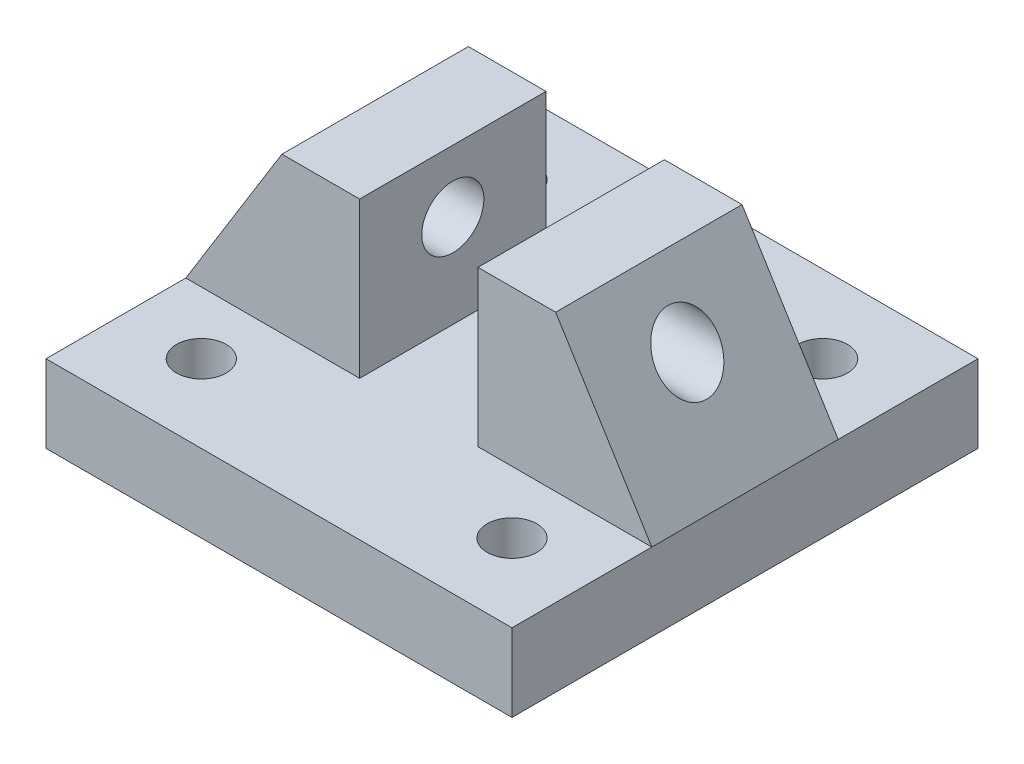
ISO-10303-21;
HEADER;
FILE_DESCRIPTION(('STEP AP214'),'2;1');
FILE_NAME('part.step','',(''),(''),'','','');
FILE_SCHEMA(('AUTOMOTIVE_DESIGN { 1 0 10303 214 1 1 1 1 }'));
ENDSEC;
DATA;
#1=APPLICATION_CONTEXT('core data for automotive mechanical design processes');
#2=APPLICATION_PROTOCOL_DEFINITION('international standard','automotive_design',2000,#1);
#3=PRODUCT_CONTEXT('',#1,'mechanical');
#4=PRODUCT('Part','Part','',(#3));
#5=PRODUCT_RELATED_PRODUCT_CATEGORY('part','',(#4));
#6=PRODUCT_DEFINITION_FORMATION('','',#4);
#7=PRODUCT_DEFINITION_CONTEXT('part definition',#1,'design');
#8=PRODUCT_DEFINITION('design','',#6,#7);
#9=PRODUCT_DEFINITION_SHAPE('','',#8);
#10=(LENGTH_UNIT() NAMED_UNIT(*) SI_UNIT(.MILLI.,.METRE.));
#11=(NAMED_UNIT(*) PLANE_ANGLE_UNIT() SI_UNIT($,.RADIAN.));
#12=(NAMED_UNIT(*) SI_UNIT($,.STERADIAN.) SOLID_ANGLE_UNIT());
#13=UNCERTAINTY_MEASURE_WITH_UNIT(LENGTH_MEASURE(1.E-05),#10,'distance_accuracy_value','');
#14=(GEOMETRIC_REPRESENTATION_CONTEXT(3) GLOBAL_UNCERTAINTY_ASSIGNED_CONTEXT((#13)) GLOBAL_UNIT_ASSIGNED_CONTEXT((#10,
#11,#12)) REPRESENTATION_CONTEXT('',''));
#15=CARTESIAN_POINT('',(0.,0.,0.));
#16=DIRECTION('',(0.,0.,1.));
#17=DIRECTION('',(1.,0.,0.));
#18=AXIS2_PLACEMENT_3D('',#15,#16,#17);
#19=CARTESIAN_POINT('',(15.,5.,-15.));
#20=DIRECTION('',(-1.,0.,0.));
#21=DIRECTION('',(0.,0.,1.));
#22=AXIS2_PLACEMENT_3D('',#19,#20,#21);
#23=PLANE('',#22);
#24=DIRECTION('',(0.,0.,-1.));
#25=VECTOR('',#24,1.);
#26=CARTESIAN_POINT('',(15.,5.,-15.));
#27=LINE('',#26,#25);
#28=CARTESIAN_POINT('',(15.,5.,-6.));
#29=VERTEX_POINT('',#28);
#30=CARTESIAN_POINT('',(15.,5.,-15.));
#31=VERTEX_POINT('',#30);
#32=EDGE_CURVE('E151',#29,#31,#27,.T.);
#33=ORIENTED_EDGE('',*,*,#32,.F.);
#34=DIRECTION('',(0.,0.,1.));
#35=VECTOR('',#34,1.);
#36=CARTESIAN_POINT('',(15.,5.,-6.));
#37=LINE('',#36,#35);
#38=CARTESIAN_POINT('',(15.,5.,6.));
#39=VERTEX_POINT('',#38);
#40=EDGE_CURVE('E139',#29,#39,#37,.T.);
#41=ORIENTED_EDGE('',*,*,#40,.T.);
#42=CARTESIAN_POINT('',(15.,5.,15.));
#43=VERTEX_POINT('',#42);
#44=EDGE_CURVE('E149',#43,#39,#27,.T.);
#45=ORIENTED_EDGE('',*,*,#44,.F.);
#46=DIRECTION('',(0.,-1.,0.));
#47=VECTOR('',#46,1.);
#48=CARTESIAN_POINT('',(15.,5.,15.));
#49=LINE('',#48,#47);
#50=CARTESIAN_POINT('',(15.,0.,15.));
#51=VERTEX_POINT('',#50);
#52=EDGE_CURVE('E170',#43,#51,#49,.T.);
#53=ORIENTED_EDGE('',*,*,#52,.T.);
#54=DIRECTION('',(0.,0.,-1.));
#55=VECTOR('',#54,1.);
#56=CARTESIAN_POINT('',(15.,0.,-15.));
#57=LINE('',#56,#55);
#58=CARTESIAN_POINT('',(15.,0.,-15.));
#59=VERTEX_POINT('',#58);
#60=EDGE_CURVE('E171',#51,#59,#57,.T.);
#61=ORIENTED_EDGE('',*,*,#60,.T.);
#62=DIRECTION('',(0.,-1.,0.));
#63=VECTOR('',#62,1.);
#64=CARTESIAN_POINT('',(15.,5.,-15.));
#65=LINE('',#64,#63);
#66=EDGE_CURVE('E11',#31,#59,#65,.T.);
#67=ORIENTED_EDGE('',*,*,#66,.F.);
#68=EDGE_LOOP('',(#33,#41,#45,#53,#61,#67));
#69=FACE_BOUND('',#68,.T.);
#70=ADVANCED_FACE('F34',(#69),#23,.F.);
#71=CARTESIAN_POINT('',(-15.,5.,-15.));
#72=DIRECTION('',(0.,0.,1.));
#73=DIRECTION('',(1.,0.,0.));
#74=AXIS2_PLACEMENT_3D('',#71,#72,#73);
#75=PLANE('',#74);
#76=DIRECTION('',(-1.,0.,0.));
#77=VECTOR('',#76,1.);
#78=CARTESIAN_POINT('',(-15.,0.,-15.));
#79=LINE('',#78,#77);
#80=CARTESIAN_POINT('',(-15.,0.,-15.));
#81=VERTEX_POINT('',#80);
#82=EDGE_CURVE('E173',#59,#81,#79,.T.);
#83=ORIENTED_EDGE('',*,*,#82,.T.);
#84=DIRECTION('',(0.,-1.,0.));
#85=VECTOR('',#84,1.);
#86=CARTESIAN_POINT('',(-15.,5.,-15.));
#87=LINE('',#86,#85);
#88=CARTESIAN_POINT('',(-15.,5.,-15.));
#89=VERTEX_POINT('',#88);
#90=EDGE_CURVE('E42',#89,#81,#87,.T.);
#91=ORIENTED_EDGE('',*,*,#90,.F.);
#92=DIRECTION('',(-1.,0.,0.));
#93=VECTOR('',#92,1.);
#94=CARTESIAN_POINT('',(-15.,5.,-15.));
#95=LINE('',#94,#93);
#96=EDGE_CURVE('E159',#31,#89,#95,.T.);
#97=ORIENTED_EDGE('',*,*,#96,.F.);
#98=ORIENTED_EDGE('',*,*,#66,.T.);
#99=EDGE_LOOP('',(#83,#91,#97,#98));
#100=FACE_BOUND('',#99,.T.);
#101=ADVANCED_FACE('F200',(#100),#75,.F.);
#102=CARTESIAN_POINT('',(-15.,5.,-15.));
#103=DIRECTION('',(1.,0.,0.));
#104=DIRECTION('',(0.,0.,-1.));
#105=AXIS2_PLACEMENT_3D('',#102,#103,#104);
#106=PLANE('',#105);
#107=DIRECTION('',(0.,0.,1.));
#108=VECTOR('',#107,1.);
#109=CARTESIAN_POINT('',(-15.,0.,-15.));
#110=LINE('',#109,#108);
#111=CARTESIAN_POINT('',(-15.,0.,15.));
#112=VERTEX_POINT('',#111);
#113=EDGE_CURVE('E176',#81,#112,#110,.T.);
#114=ORIENTED_EDGE('',*,*,#113,.T.);
#115=DIRECTION('',(0.,-1.,0.));
#116=VECTOR('',#115,1.);
#117=CARTESIAN_POINT('',(-15.,5.,15.));
#118=LINE('',#117,#116);
#119=CARTESIAN_POINT('',(-15.,5.,15.));
#120=VERTEX_POINT('',#119);
#121=EDGE_CURVE('E180',#120,#112,#118,.T.);
#122=ORIENTED_EDGE('',*,*,#121,.F.);
#123=DIRECTION('',(0.,0.,1.));
#124=VECTOR('',#123,1.);
#125=CARTESIAN_POINT('',(-15.,5.,-15.));
#126=LINE('',#125,#124);
#127=CARTESIAN_POINT('',(-15.,5.,6.));
#128=VERTEX_POINT('',#127);
#129=EDGE_CURVE('E161',#128,#120,#126,.T.);
#130=ORIENTED_EDGE('',*,*,#129,.F.);
#131=DIRECTION('',(0.,0.,1.));
#132=VECTOR('',#131,1.);
#133=CARTESIAN_POINT('',(-15.,5.,-6.));
#134=LINE('',#133,#132);
#135=CARTESIAN_POINT('',(-15.,5.,-6.));
#136=VERTEX_POINT('',#135);
#137=EDGE_CURVE('E217',#136,#128,#134,.T.);
#138=ORIENTED_EDGE('',*,*,#137,.F.);
#139=EDGE_CURVE('E166',#89,#136,#126,.T.);
#140=ORIENTED_EDGE('',*,*,#139,.F.);
#141=ORIENTED_EDGE('',*,*,#90,.T.);
#142=EDGE_LOOP('',(#114,#122,#130,#138,#140,#141));
#143=FACE_BOUND('',#142,.T.);
#144=ADVANCED_FACE('F188',(#143),#106,.F.);
#145=CARTESIAN_POINT('',(-15.,5.,15.));
#146=DIRECTION('',(0.,0.,-1.));
#147=DIRECTION('',(-1.,0.,0.));
#148=AXIS2_PLACEMENT_3D('',#145,#146,#147);
#149=PLANE('',#148);
#150=DIRECTION('',(1.,0.,0.));
#151=VECTOR('',#150,1.);
#152=CARTESIAN_POINT('',(-15.,0.,15.));
#153=LINE('',#152,#151);
#154=EDGE_CURVE('E163',#112,#51,#153,.T.);
#155=ORIENTED_EDGE('',*,*,#154,.T.);
#156=ORIENTED_EDGE('',*,*,#52,.F.);
#157=DIRECTION('',(1.,0.,0.));
#158=VECTOR('',#157,1.);
#159=CARTESIAN_POINT('',(-15.,5.,15.));
#160=LINE('',#159,#158);
#161=EDGE_CURVE('E157',#120,#43,#160,.T.);
#162=ORIENTED_EDGE('',*,*,#161,.F.);
#163=ORIENTED_EDGE('',*,*,#121,.T.);
#164=EDGE_LOOP('',(#155,#156,#162,#163));
#165=FACE_BOUND('',#164,.T.);
#166=ADVANCED_FACE('F199',(#165),#149,.F.);
#167=CARTESIAN_POINT('',(0.,5.,0.));
#168=DIRECTION('',(0.,1.,0.));
#169=DIRECTION('',(0.,0.,1.));
#170=AXIS2_PLACEMENT_3D('',#167,#168,#169);
#171=PLANE('',#170);
#172=CARTESIAN_POINT('',(-10.,5.,-10.));
#173=DIRECTION('',(0.,1.,0.));
#174=DIRECTION('',(0.,0.,1.));
#175=AXIS2_PLACEMENT_3D('',#172,#173,#174);
#176=CIRCLE('',#175,1.6);
#177=CARTESIAN_POINT('',(-10.,5.,-8.4));
#178=VERTEX_POINT('',#177);
#179=EDGE_CURVE('E475',#178,#178,#176,.T.);
#180=ORIENTED_EDGE('',*,*,#179,.F.);
#181=EDGE_LOOP('',(#180));
#182=FACE_BOUND('',#181,.T.);
#183=CARTESIAN_POINT('',(10.,5.,-10.));
#184=DIRECTION('',(0.,1.,0.));
#185=DIRECTION('',(0.,0.,1.));
#186=AXIS2_PLACEMENT_3D('',#183,#184,#185);
#187=CIRCLE('',#186,1.6);
#188=CARTESIAN_POINT('',(10.,5.,-8.4));
#189=VERTEX_POINT('',#188);
#190=EDGE_CURVE('E481',#189,#189,#187,.T.);
#191=ORIENTED_EDGE('',*,*,#190,.F.);
#192=EDGE_LOOP('',(#191));
#193=FACE_BOUND('',#192,.T.);
#194=CARTESIAN_POINT('',(10.,5.,10.));
#195=DIRECTION('',(0.,1.,0.));
#196=DIRECTION('',(0.,0.,1.));
#197=AXIS2_PLACEMENT_3D('',#194,#195,#196);
#198=CIRCLE('',#197,1.6);
#199=CARTESIAN_POINT('',(10.,5.,11.6));
#200=VERTEX_POINT('',#199);
#201=EDGE_CURVE('E487',#200,#200,#198,.T.);
#202=ORIENTED_EDGE('',*,*,#201,.F.);
#203=EDGE_LOOP('',(#202));
#204=FACE_BOUND('',#203,.T.);
#205=CARTESIAN_POINT('',(-10.,5.,10.));
#206=DIRECTION('',(0.,1.,0.));
#207=DIRECTION('',(0.,0.,1.));
#208=AXIS2_PLACEMENT_3D('',#205,#206,#207);
#209=CIRCLE('',#208,1.6);
#210=CARTESIAN_POINT('',(-10.,5.,11.6));
#211=VERTEX_POINT('',#210);
#212=EDGE_CURVE('E493',#211,#211,#209,.T.);
#213=ORIENTED_EDGE('',*,*,#212,.F.);
#214=EDGE_LOOP('',(#213));
#215=FACE_BOUND('',#214,.T.);
#216=DIRECTION('',(-1.,0.,0.));
#217=VECTOR('',#216,1.);
#218=CARTESIAN_POINT('',(0.,5.,-6.));
#219=LINE('',#218,#217);
#220=CARTESIAN_POINT('',(3.81,5.,-6.));
#221=VERTEX_POINT('',#220);
#222=EDGE_CURVE('E174',#29,#221,#219,.T.);
#223=ORIENTED_EDGE('',*,*,#222,.F.);
#224=ORIENTED_EDGE('',*,*,#32,.T.);
#225=ORIENTED_EDGE('',*,*,#96,.T.);
#226=ORIENTED_EDGE('',*,*,#139,.T.);
#227=CARTESIAN_POINT('',(-3.81,5.,-6.));
#228=VERTEX_POINT('',#227);
#229=EDGE_CURVE('E132',#228,#136,#219,.T.);
#230=ORIENTED_EDGE('',*,*,#229,.F.);
#231=DIRECTION('',(0.,0.,1.));
#232=VECTOR('',#231,1.);
#233=CARTESIAN_POINT('',(-3.81,5.,-6.));
#234=LINE('',#233,#232);
#235=CARTESIAN_POINT('',(-3.81,5.,6.));
#236=VERTEX_POINT('',#235);
#237=EDGE_CURVE('E230',#228,#236,#234,.T.);
#238=ORIENTED_EDGE('',*,*,#237,.T.);
#239=DIRECTION('',(-1.,0.,0.));
#240=VECTOR('',#239,1.);
#241=CARTESIAN_POINT('',(0.,5.,6.));
#242=LINE('',#241,#240);
#243=EDGE_CURVE('E133',#236,#128,#242,.T.);
#244=ORIENTED_EDGE('',*,*,#243,.T.);
#245=ORIENTED_EDGE('',*,*,#129,.T.);
#246=ORIENTED_EDGE('',*,*,#161,.T.);
#247=ORIENTED_EDGE('',*,*,#44,.T.);
#248=CARTESIAN_POINT('',(3.81,5.,6.));
#249=VERTEX_POINT('',#248);
#250=EDGE_CURVE('E124',#39,#249,#242,.T.);
#251=ORIENTED_EDGE('',*,*,#250,.T.);
#252=DIRECTION('',(0.,0.,1.));
#253=VECTOR('',#252,1.);
#254=CARTESIAN_POINT('',(3.81,5.,-6.));
#255=LINE('',#254,#253);
#256=EDGE_CURVE('E202',#221,#249,#255,.T.);
#257=ORIENTED_EDGE('',*,*,#256,.F.);
#258=EDGE_LOOP('',(#223,#224,#225,#226,#230,#238,#244,#245,#246,#247,#251,#257));
#259=FACE_BOUND('',#258,.T.);
#260=ADVANCED_FACE('F155',(#182,#193,#204,#215,#259),#171,.T.);
#261=CARTESIAN_POINT('',(0.,0.,0.));
#262=DIRECTION('',(0.,1.,0.));
#263=DIRECTION('',(0.,0.,1.));
#264=AXIS2_PLACEMENT_3D('',#261,#262,#263);
#265=PLANE('',#264);
#266=CARTESIAN_POINT('',(-10.,0.,-10.));
#267=DIRECTION('',(0.,1.,0.));
#268=DIRECTION('',(0.,0.,1.));
#269=AXIS2_PLACEMENT_3D('',#266,#267,#268);
#270=CIRCLE('',#269,1.6);
#271=CARTESIAN_POINT('',(-10.,0.,-8.4));
#272=VERTEX_POINT('',#271);
#273=EDGE_CURVE('E478',#272,#272,#270,.T.);
#274=ORIENTED_EDGE('',*,*,#273,.T.);
#275=EDGE_LOOP('',(#274));
#276=FACE_BOUND('',#275,.T.);
#277=CARTESIAN_POINT('',(10.,0.,-10.));
#278=DIRECTION('',(0.,1.,0.));
#279=DIRECTION('',(0.,0.,1.));
#280=AXIS2_PLACEMENT_3D('',#277,#278,#279);
#281=CIRCLE('',#280,1.6);
#282=CARTESIAN_POINT('',(10.,0.,-8.4));
#283=VERTEX_POINT('',#282);
#284=EDGE_CURVE('E484',#283,#283,#281,.T.);
#285=ORIENTED_EDGE('',*,*,#284,.T.);
#286=EDGE_LOOP('',(#285));
#287=FACE_BOUND('',#286,.T.);
#288=CARTESIAN_POINT('',(10.,0.,10.));
#289=DIRECTION('',(0.,1.,0.));
#290=DIRECTION('',(0.,0.,1.));
#291=AXIS2_PLACEMENT_3D('',#288,#289,#290);
#292=CIRCLE('',#291,1.6);
#293=CARTESIAN_POINT('',(10.,0.,11.6));
#294=VERTEX_POINT('',#293);
#295=EDGE_CURVE('E490',#294,#294,#292,.T.);
#296=ORIENTED_EDGE('',*,*,#295,.T.);
#297=EDGE_LOOP('',(#296));
#298=FACE_BOUND('',#297,.T.);
#299=CARTESIAN_POINT('',(-10.,0.,10.));
#300=DIRECTION('',(0.,1.,0.));
#301=DIRECTION('',(0.,0.,1.));
#302=AXIS2_PLACEMENT_3D('',#299,#300,#301);
#303=CIRCLE('',#302,1.6);
#304=CARTESIAN_POINT('',(-10.,0.,11.6));
#305=VERTEX_POINT('',#304);
#306=EDGE_CURVE('E143',#305,#305,#303,.T.);
#307=ORIENTED_EDGE('',*,*,#306,.T.);
#308=EDGE_LOOP('',(#307));
#309=FACE_BOUND('',#308,.T.);
#310=ORIENTED_EDGE('',*,*,#82,.F.);
#311=ORIENTED_EDGE('',*,*,#60,.F.);
#312=ORIENTED_EDGE('',*,*,#154,.F.);
#313=ORIENTED_EDGE('',*,*,#113,.F.);
#314=EDGE_LOOP('',(#310,#311,#312,#313));
#315=FACE_BOUND('',#314,.T.);
#316=ADVANCED_FACE('F196',(#276,#287,#298,#309,#315),#265,.F.);
#317=CARTESIAN_POINT('',(-8.81,15.,-6.));
#318=DIRECTION('',(0.,1.,0.));
#319=DIRECTION('',(0.,0.,1.));
#320=AXIS2_PLACEMENT_3D('',#317,#318,#319);
#321=PLANE('',#320);
#322=DIRECTION('',(0.,0.,1.));
#323=VECTOR('',#322,1.);
#324=CARTESIAN_POINT('',(-8.81,15.,-6.));
#325=LINE('',#324,#323);
#326=CARTESIAN_POINT('',(-8.81,15.,-6.));
#327=VERTEX_POINT('',#326);
#328=CARTESIAN_POINT('',(-8.81,15.,6.));
#329=VERTEX_POINT('',#328);
#330=EDGE_CURVE('E219',#327,#329,#325,.T.);
#331=ORIENTED_EDGE('',*,*,#330,.T.);
#332=DIRECTION('',(-1.,0.,0.));
#333=VECTOR('',#332,1.);
#334=CARTESIAN_POINT('',(-8.81,15.,6.));
#335=LINE('',#334,#333);
#336=CARTESIAN_POINT('',(-3.81,15.,6.));
#337=VERTEX_POINT('',#336);
#338=EDGE_CURVE('E246',#337,#329,#335,.T.);
#339=ORIENTED_EDGE('',*,*,#338,.F.);
#340=DIRECTION('',(0.,0.,1.));
#341=VECTOR('',#340,1.);
#342=CARTESIAN_POINT('',(-3.81,15.,-6.));
#343=LINE('',#342,#341);
#344=CARTESIAN_POINT('',(-3.81,15.,-6.));
#345=VERTEX_POINT('',#344);
#346=EDGE_CURVE('E225',#345,#337,#343,.T.);
#347=ORIENTED_EDGE('',*,*,#346,.F.);
#348=DIRECTION('',(-1.,0.,0.));
#349=VECTOR('',#348,1.);
#350=CARTESIAN_POINT('',(-8.81,15.,-6.));
#351=LINE('',#350,#349);
#352=EDGE_CURVE('E221',#345,#327,#351,.T.);
#353=ORIENTED_EDGE('',*,*,#352,.T.);
#354=EDGE_LOOP('',(#331,#339,#347,#353));
#355=FACE_BOUND('',#354,.T.);
#356=ADVANCED_FACE('F257',(#355),#321,.T.);
#357=CARTESIAN_POINT('',(0.,0.,-6.));
#358=DIRECTION('',(0.,0.,-1.));
#359=DIRECTION('',(-1.,0.,0.));
#360=AXIS2_PLACEMENT_3D('',#357,#358,#359);
#361=PLANE('',#360);
#362=DIRECTION('',(0.,1.,0.));
#363=VECTOR('',#362,1.);
#364=CARTESIAN_POINT('',(-3.81,15.,-6.));
#365=LINE('',#364,#363);
#366=EDGE_CURVE('E213',#228,#345,#365,.T.);
#367=ORIENTED_EDGE('',*,*,#366,.F.);
#368=ORIENTED_EDGE('',*,*,#229,.T.);
#369=DIRECTION('',(-0.526325342257478,-0.850283266974924,0.));
#370=VECTOR('',#369,1.);
#371=CARTESIAN_POINT('',(-15.,5.,-6.));
#372=LINE('',#371,#370);
#373=EDGE_CURVE('E152',#327,#136,#372,.T.);
#374=ORIENTED_EDGE('',*,*,#373,.F.);
#375=ORIENTED_EDGE('',*,*,#352,.F.);
#376=EDGE_LOOP('',(#367,#368,#374,#375));
#377=FACE_BOUND('',#376,.T.);
#378=ADVANCED_FACE('F210',(#377),#361,.T.);
#379=CARTESIAN_POINT('',(0.,0.,6.));
#380=DIRECTION('',(0.,0.,-1.));
#381=DIRECTION('',(-1.,0.,0.));
#382=AXIS2_PLACEMENT_3D('',#379,#380,#381);
#383=PLANE('',#382);
#384=ORIENTED_EDGE('',*,*,#243,.F.);
#385=DIRECTION('',(0.,1.,0.));
#386=VECTOR('',#385,1.);
#387=CARTESIAN_POINT('',(-3.81,15.,6.));
#388=LINE('',#387,#386);
#389=EDGE_CURVE('E243',#236,#337,#388,.T.);
#390=ORIENTED_EDGE('',*,*,#389,.T.);
#391=ORIENTED_EDGE('',*,*,#338,.T.);
#392=DIRECTION('',(-0.526325342257478,-0.850283266974924,0.));
#393=VECTOR('',#392,1.);
#394=CARTESIAN_POINT('',(-15.,5.,6.));
#395=LINE('',#394,#393);
#396=EDGE_CURVE('E57',#329,#128,#395,.T.);
#397=ORIENTED_EDGE('',*,*,#396,.T.);
#398=EDGE_LOOP('',(#384,#390,#391,#397));
#399=FACE_BOUND('',#398,.T.);
#400=ADVANCED_FACE('F262',(#399),#383,.F.);
#401=CARTESIAN_POINT('',(-3.81,15.,-6.));
#402=DIRECTION('',(1.,0.,0.));
#403=DIRECTION('',(0.,1.,0.));
#404=AXIS2_PLACEMENT_3D('',#401,#402,#403);
#405=PLANE('',#404);
#406=CARTESIAN_POINT('',(-3.81,11.,0.));
#407=DIRECTION('',(1.,0.,0.));
#408=DIRECTION('',(0.,1.,0.));
#409=AXIS2_PLACEMENT_3D('',#406,#407,#408);
#410=CIRCLE('',#409,2.);
#411=CARTESIAN_POINT('',(-3.81,13.,0.));
#412=VERTEX_POINT('',#411);
#413=EDGE_CURVE('E472',#412,#412,#410,.F.);
#414=ORIENTED_EDGE('',*,*,#413,.T.);
#415=EDGE_LOOP('',(#414));
#416=FACE_BOUND('',#415,.T.);
#417=ORIENTED_EDGE('',*,*,#346,.T.);
#418=ORIENTED_EDGE('',*,*,#389,.F.);
#419=ORIENTED_EDGE('',*,*,#237,.F.);
#420=ORIENTED_EDGE('',*,*,#366,.T.);
#421=EDGE_LOOP('',(#417,#418,#419,#420));
#422=FACE_BOUND('',#421,.T.);
#423=ADVANCED_FACE('F260',(#416,#422),#405,.T.);
#424=CARTESIAN_POINT('',(-15.,5.,-6.));
#425=DIRECTION('',(-0.850283266974924,0.526325342257478,0.));
#426=DIRECTION('',(-0.526325342257478,-0.850283266974924,0.));
#427=AXIS2_PLACEMENT_3D('',#424,#425,#426);
#428=PLANE('',#427);
#429=ORIENTED_EDGE('',*,*,#137,.T.);
#430=ORIENTED_EDGE('',*,*,#396,.F.);
#431=ORIENTED_EDGE('',*,*,#330,.F.);
#432=ORIENTED_EDGE('',*,*,#373,.T.);
#433=EDGE_LOOP('',(#429,#430,#431,#432));
#434=FACE_BOUND('',#433,.T.);
#435=ADVANCED_FACE('F216',(#434),#428,.T.);
#436=DIRECTION('',(-0.526325342257478,0.850283266974924,0.));
#437=VECTOR('',#436,1.);
#438=CARTESIAN_POINT('',(15.,5.,-6.));
#439=LINE('',#438,#437);
#440=CARTESIAN_POINT('',(8.81,15.,-6.));
#441=VERTEX_POINT('',#440);
#442=EDGE_CURVE('E251',#29,#441,#439,.T.);
#443=ORIENTED_EDGE('',*,*,#442,.F.);
#444=ORIENTED_EDGE('',*,*,#222,.T.);
#445=DIRECTION('',(0.,-1.,0.));
#446=VECTOR('',#445,1.);
#447=CARTESIAN_POINT('',(3.81,15.,-6.));
#448=LINE('',#447,#446);
#449=CARTESIAN_POINT('',(3.81,15.,-6.));
#450=VERTEX_POINT('',#449);
#451=EDGE_CURVE('E254',#450,#221,#448,.T.);
#452=ORIENTED_EDGE('',*,*,#451,.F.);
#453=DIRECTION('',(-1.,0.,0.));
#454=VECTOR('',#453,1.);
#455=CARTESIAN_POINT('',(8.81,15.,-6.));
#456=LINE('',#455,#454);
#457=EDGE_CURVE('E239',#441,#450,#456,.T.);
#458=ORIENTED_EDGE('',*,*,#457,.F.);
#459=EDGE_LOOP('',(#443,#444,#452,#458));
#460=FACE_BOUND('',#459,.T.);
#461=ADVANCED_FACE('F272',(#460),#361,.T.);
#462=ORIENTED_EDGE('',*,*,#250,.F.);
#463=DIRECTION('',(-0.526325342257478,0.850283266974924,0.));
#464=VECTOR('',#463,1.);
#465=CARTESIAN_POINT('',(15.,5.,6.));
#466=LINE('',#465,#464);
#467=CARTESIAN_POINT('',(8.81,15.,6.));
#468=VERTEX_POINT('',#467);
#469=EDGE_CURVE('E127',#39,#468,#466,.T.);
#470=ORIENTED_EDGE('',*,*,#469,.T.);
#471=DIRECTION('',(-1.,0.,0.));
#472=VECTOR('',#471,1.);
#473=CARTESIAN_POINT('',(8.81,15.,6.));
#474=LINE('',#473,#472);
#475=CARTESIAN_POINT('',(3.81,15.,6.));
#476=VERTEX_POINT('',#475);
#477=EDGE_CURVE('E142',#468,#476,#474,.T.);
#478=ORIENTED_EDGE('',*,*,#477,.T.);
#479=DIRECTION('',(0.,-1.,0.));
#480=VECTOR('',#479,1.);
#481=CARTESIAN_POINT('',(3.81,15.,6.));
#482=LINE('',#481,#480);
#483=EDGE_CURVE('E49',#476,#249,#482,.T.);
#484=ORIENTED_EDGE('',*,*,#483,.T.);
#485=EDGE_LOOP('',(#462,#470,#478,#484));
#486=FACE_BOUND('',#485,.T.);
#487=ADVANCED_FACE('F126',(#486),#383,.F.);
#488=CARTESIAN_POINT('',(3.81,15.,-6.));
#489=DIRECTION('',(-1.,0.,0.));
#490=DIRECTION('',(0.,-1.,0.));
#491=AXIS2_PLACEMENT_3D('',#488,#489,#490);
#492=PLANE('',#491);
#493=CARTESIAN_POINT('',(3.81,11.,0.));
#494=DIRECTION('',(-1.,0.,0.));
#495=DIRECTION('',(0.,-1.,0.));
#496=AXIS2_PLACEMENT_3D('',#493,#494,#495);
#497=CIRCLE('',#496,2.);
#498=CARTESIAN_POINT('',(3.81,9.,0.));
#499=VERTEX_POINT('',#498);
#500=EDGE_CURVE('E468',#499,#499,#497,.F.);
#501=ORIENTED_EDGE('',*,*,#500,.T.);
#502=EDGE_LOOP('',(#501));
#503=FACE_BOUND('',#502,.T.);
#504=ORIENTED_EDGE('',*,*,#256,.T.);
#505=ORIENTED_EDGE('',*,*,#483,.F.);
#506=DIRECTION('',(0.,0.,1.));
#507=VECTOR('',#506,1.);
#508=CARTESIAN_POINT('',(3.81,15.,-6.));
#509=LINE('',#508,#507);
#510=EDGE_CURVE('E233',#450,#476,#509,.T.);
#511=ORIENTED_EDGE('',*,*,#510,.F.);
#512=ORIENTED_EDGE('',*,*,#451,.T.);
#513=EDGE_LOOP('',(#504,#505,#511,#512));
#514=FACE_BOUND('',#513,.T.);
#515=ADVANCED_FACE('F242',(#503,#514),#492,.T.);
#516=CARTESIAN_POINT('',(8.81,15.,-6.));
#517=DIRECTION('',(0.,1.,0.));
#518=DIRECTION('',(0.,0.,1.));
#519=AXIS2_PLACEMENT_3D('',#516,#517,#518);
#520=PLANE('',#519);
#521=ORIENTED_EDGE('',*,*,#510,.T.);
#522=ORIENTED_EDGE('',*,*,#477,.F.);
#523=DIRECTION('',(0.,0.,1.));
#524=VECTOR('',#523,1.);
#525=CARTESIAN_POINT('',(8.81,15.,-6.));
#526=LINE('',#525,#524);
#527=EDGE_CURVE('E141',#441,#468,#526,.T.);
#528=ORIENTED_EDGE('',*,*,#527,.F.);
#529=ORIENTED_EDGE('',*,*,#457,.T.);
#530=EDGE_LOOP('',(#521,#522,#528,#529));
#531=FACE_BOUND('',#530,.T.);
#532=ADVANCED_FACE('F237',(#531),#520,.T.);
#533=CARTESIAN_POINT('',(15.,5.,-6.));
#534=DIRECTION('',(0.850283266974924,0.526325342257478,0.));
#535=DIRECTION('',(-0.526325342257478,0.850283266974924,0.));
#536=AXIS2_PLACEMENT_3D('',#533,#534,#535);
#537=PLANE('',#536);
#538=CARTESIAN_POINT('',(11.286,11.,0.));
#539=DIRECTION('',(0.850283266974924,0.526325342257478,0.));
#540=DIRECTION('',(-0.526325342257478,0.850283266974924,0.));
#541=AXIS2_PLACEMENT_3D('',#538,#539,#540);
#542=ELLIPSE('',#541,2.3521573076646,2.);
#543=CARTESIAN_POINT('',(10.048,13.,0.));
#544=VERTEX_POINT('',#543);
#545=EDGE_CURVE('E37',#544,#544,#542,.F.);
#546=ORIENTED_EDGE('',*,*,#545,.T.);
#547=EDGE_LOOP('',(#546));
#548=FACE_BOUND('',#547,.T.);
#549=ORIENTED_EDGE('',*,*,#527,.T.);
#550=ORIENTED_EDGE('',*,*,#469,.F.);
#551=ORIENTED_EDGE('',*,*,#40,.F.);
#552=ORIENTED_EDGE('',*,*,#442,.T.);
#553=EDGE_LOOP('',(#549,#550,#551,#552));
#554=FACE_BOUND('',#553,.T.);
#555=ADVANCED_FACE('F137',(#548,#554),#537,.T.);
#556=CARTESIAN_POINT('',(-10.,5.,10.));
#557=DIRECTION('',(0.,1.,0.));
#558=DIRECTION('',(0.,0.,1.));
#559=AXIS2_PLACEMENT_3D('',#556,#557,#558);
#560=CYLINDRICAL_SURFACE('',#559,1.6);
#561=ORIENTED_EDGE('',*,*,#306,.F.);
#562=EDGE_LOOP('',(#561));
#563=FACE_BOUND('',#562,.T.);
#564=ORIENTED_EDGE('',*,*,#212,.T.);
#565=EDGE_LOOP('',(#564));
#566=FACE_BOUND('',#565,.T.);
#567=ADVANCED_FACE('F294',(#563,#566),#560,.F.);
#568=CARTESIAN_POINT('',(10.,5.,10.));
#569=DIRECTION('',(0.,1.,0.));
#570=DIRECTION('',(0.,0.,1.));
#571=AXIS2_PLACEMENT_3D('',#568,#569,#570);
#572=CYLINDRICAL_SURFACE('',#571,1.6);
#573=ORIENTED_EDGE('',*,*,#295,.F.);
#574=EDGE_LOOP('',(#573));
#575=FACE_BOUND('',#574,.T.);
#576=ORIENTED_EDGE('',*,*,#201,.T.);
#577=EDGE_LOOP('',(#576));
#578=FACE_BOUND('',#577,.T.);
#579=ADVANCED_FACE('F334',(#575,#578),#572,.F.);
#580=CARTESIAN_POINT('',(10.,5.,-10.));
#581=DIRECTION('',(0.,1.,0.));
#582=DIRECTION('',(0.,0.,1.));
#583=AXIS2_PLACEMENT_3D('',#580,#581,#582);
#584=CYLINDRICAL_SURFACE('',#583,1.6);
#585=ORIENTED_EDGE('',*,*,#284,.F.);
#586=EDGE_LOOP('',(#585));
#587=FACE_BOUND('',#586,.T.);
#588=ORIENTED_EDGE('',*,*,#190,.T.);
#589=EDGE_LOOP('',(#588));
#590=FACE_BOUND('',#589,.T.);
#591=ADVANCED_FACE('F342',(#587,#590),#584,.F.);
#592=CARTESIAN_POINT('',(-10.,5.,-10.));
#593=DIRECTION('',(0.,1.,0.));
#594=DIRECTION('',(0.,0.,1.));
#595=AXIS2_PLACEMENT_3D('',#592,#593,#594);
#596=CYLINDRICAL_SURFACE('',#595,1.6);
#597=ORIENTED_EDGE('',*,*,#273,.F.);
#598=EDGE_LOOP('',(#597));
#599=FACE_BOUND('',#598,.T.);
#600=ORIENTED_EDGE('',*,*,#179,.T.);
#601=EDGE_LOOP('',(#600));
#602=FACE_BOUND('',#601,.T.);
#603=ADVANCED_FACE('F350',(#599,#602),#596,.F.);
#604=CARTESIAN_POINT('',(15.,11.,0.));
#605=DIRECTION('',(-1.,0.,0.));
#606=DIRECTION('',(0.,0.,1.));
#607=AXIS2_PLACEMENT_3D('',#604,#605,#606);
#608=CYLINDRICAL_SURFACE('',#607,2.);
#609=ORIENTED_EDGE('',*,*,#500,.F.);
#610=EDGE_LOOP('',(#609));
#611=FACE_BOUND('',#610,.T.);
#612=ORIENTED_EDGE('',*,*,#545,.F.);
#613=EDGE_LOOP('',(#612));
#614=FACE_BOUND('',#613,.T.);
#615=ADVANCED_FACE('F358',(#611,#614),#608,.F.);
#616=ORIENTED_EDGE('',*,*,#413,.F.);
#617=EDGE_LOOP('',(#616));
#618=FACE_BOUND('',#617,.T.);
#619=CARTESIAN_POINT('',(-8.,11.,0.));
#620=DIRECTION('',(1.,0.,0.));
#621=DIRECTION('',(0.,0.,-1.));
#622=AXIS2_PLACEMENT_3D('',#619,#620,#621);
#623=CIRCLE('',#622,2.);
#624=CARTESIAN_POINT('',(-8.,11.,-2.));
#625=VERTEX_POINT('',#624);
#626=EDGE_CURVE('E464',#625,#625,#623,.T.);
#627=ORIENTED_EDGE('',*,*,#626,.F.);
#628=EDGE_LOOP('',(#627));
#629=FACE_BOUND('',#628,.T.);
#630=ADVANCED_FACE('F365',(#618,#629),#608,.F.);
#631=CARTESIAN_POINT('',(-8.,11.,0.));
#632=DIRECTION('',(1.,0.,0.));
#633=DIRECTION('',(0.,0.,-1.));
#634=AXIS2_PLACEMENT_3D('',#631,#632,#633);
#635=PLANE('',#634);
#636=ORIENTED_EDGE('',*,*,#626,.T.);
#637=EDGE_LOOP('',(#636));
#638=FACE_BOUND('',#637,.T.);
#639=ADVANCED_FACE('F373',(#638),#635,.T.);
#640=CLOSED_SHELL('',(#70,#101,#144,#166,#260,#316,#356,#378,#400,#423,#435,#461,#487,#515,#532,
#555,#567,#579,#591,#603,#615,#630,#639));
#641=MANIFOLD_SOLID_BREP('B2',#640);
#642=ADVANCED_BREP_SHAPE_REPRESENTATION('',(#18,#641),#14);
#643=SHAPE_DEFINITION_REPRESENTATION(#9,#642);
ENDSEC;
END-ISO-10303-21;
